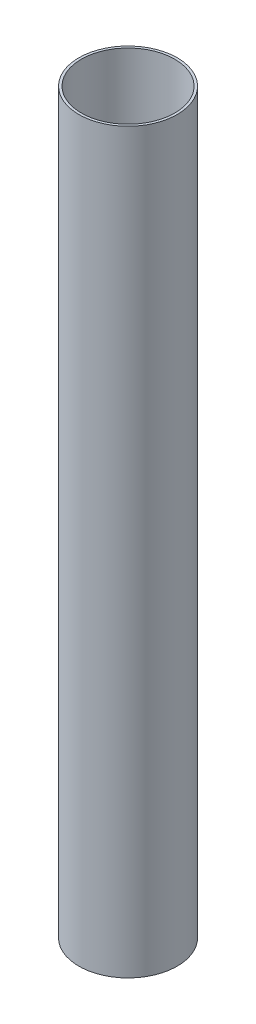
ISO-10303-21;
HEADER;
FILE_DESCRIPTION(('STEP AP214'),'2;1');
FILE_NAME('part.step','',(''),(''),'','','');
FILE_SCHEMA(('AUTOMOTIVE_DESIGN { 1 0 10303 214 1 1 1 1 }'));
ENDSEC;
DATA;
#1=APPLICATION_CONTEXT('core data for automotive mechanical design processes');
#2=APPLICATION_PROTOCOL_DEFINITION('international standard','automotive_design',2000,#1);
#3=PRODUCT_CONTEXT('',#1,'mechanical');
#4=PRODUCT('Part','Part','',(#3));
#5=PRODUCT_RELATED_PRODUCT_CATEGORY('part','',(#4));
#6=PRODUCT_DEFINITION_FORMATION('','',#4);
#7=PRODUCT_DEFINITION_CONTEXT('part definition',#1,'design');
#8=PRODUCT_DEFINITION('design','',#6,#7);
#9=PRODUCT_DEFINITION_SHAPE('','',#8);
#10=(LENGTH_UNIT() NAMED_UNIT(*) SI_UNIT(.MILLI.,.METRE.));
#11=(NAMED_UNIT(*) PLANE_ANGLE_UNIT() SI_UNIT($,.RADIAN.));
#12=(NAMED_UNIT(*) SI_UNIT($,.STERADIAN.) SOLID_ANGLE_UNIT());
#13=UNCERTAINTY_MEASURE_WITH_UNIT(LENGTH_MEASURE(1.E-05),#10,'distance_accuracy_value','');
#14=(GEOMETRIC_REPRESENTATION_CONTEXT(3) GLOBAL_UNCERTAINTY_ASSIGNED_CONTEXT((#13)) GLOBAL_UNIT_ASSIGNED_CONTEXT((#10,
#11,#12)) REPRESENTATION_CONTEXT('',''));
#15=CARTESIAN_POINT('',(0.,0.,0.));
#16=DIRECTION('',(0.,0.,1.));
#17=DIRECTION('',(1.,0.,0.));
#18=AXIS2_PLACEMENT_3D('',#15,#16,#17);
#19=CARTESIAN_POINT('',(0.,152.4,0.));
#20=DIRECTION('',(0.,1.,0.));
#21=DIRECTION('',(0.,0.,1.));
#22=AXIS2_PLACEMENT_3D('',#19,#20,#21);
#23=PLANE('',#22);
#24=CARTESIAN_POINT('',(0.,152.4,0.));
#25=DIRECTION('',(0.,1.,0.));
#26=DIRECTION('',(0.,0.,1.));
#27=AXIS2_PLACEMENT_3D('',#24,#25,#26);
#28=CIRCLE('',#27,20.32);
#29=CARTESIAN_POINT('',(0.,152.4,-20.32));
#30=VERTEX_POINT('',#29);
#31=EDGE_CURVE('E10',#30,#30,#28,.T.);
#32=ORIENTED_EDGE('',*,*,#31,.T.);
#33=EDGE_LOOP('',(#32));
#34=FACE_BOUND('',#33,.T.);
#35=CARTESIAN_POINT('',(0.,152.4,0.));
#36=DIRECTION('',(0.,1.,0.));
#37=DIRECTION('',(0.,0.,1.));
#38=AXIS2_PLACEMENT_3D('',#35,#36,#37);
#39=CIRCLE('',#38,19.304);
#40=CARTESIAN_POINT('',(0.,152.4,-19.304));
#41=VERTEX_POINT('',#40);
#42=EDGE_CURVE('E46',#41,#41,#39,.T.);
#43=ORIENTED_EDGE('',*,*,#42,.F.);
#44=EDGE_LOOP('',(#43));
#45=FACE_BOUND('',#44,.T.);
#46=ADVANCED_FACE('F35',(#34,#45),#23,.T.);
#47=CARTESIAN_POINT('',(0.,-152.4,0.));
#48=DIRECTION('',(0.,1.,0.));
#49=DIRECTION('',(0.,0.,1.));
#50=AXIS2_PLACEMENT_3D('',#47,#48,#49);
#51=PLANE('',#50);
#52=CARTESIAN_POINT('',(0.,-152.4,0.));
#53=DIRECTION('',(0.,1.,0.));
#54=DIRECTION('',(0.,0.,1.));
#55=AXIS2_PLACEMENT_3D('',#52,#53,#54);
#56=CIRCLE('',#55,20.32);
#57=CARTESIAN_POINT('',(0.,-152.4,-20.32));
#58=VERTEX_POINT('',#57);
#59=EDGE_CURVE('E39',#58,#58,#56,.T.);
#60=ORIENTED_EDGE('',*,*,#59,.F.);
#61=EDGE_LOOP('',(#60));
#62=FACE_BOUND('',#61,.T.);
#63=CARTESIAN_POINT('',(0.,-152.4,0.));
#64=DIRECTION('',(0.,1.,0.));
#65=DIRECTION('',(0.,0.,1.));
#66=AXIS2_PLACEMENT_3D('',#63,#64,#65);
#67=CIRCLE('',#66,19.304);
#68=CARTESIAN_POINT('',(0.,-152.4,-19.304));
#69=VERTEX_POINT('',#68);
#70=EDGE_CURVE('E48',#69,#69,#67,.T.);
#71=ORIENTED_EDGE('',*,*,#70,.T.);
#72=EDGE_LOOP('',(#71));
#73=FACE_BOUND('',#72,.T.);
#74=ADVANCED_FACE('F58',(#62,#73),#51,.F.);
#75=CARTESIAN_POINT('',(0.,152.4,0.));
#76=DIRECTION('',(0.,-1.,0.));
#77=DIRECTION('',(0.,0.,-1.));
#78=AXIS2_PLACEMENT_3D('',#75,#76,#77);
#79=CYLINDRICAL_SURFACE('',#78,20.32);
#80=CARTESIAN_POINT('',(0.,152.4,-20.32));
#81=CARTESIAN_POINT('',(0.,149.225,-20.32));
#82=CARTESIAN_POINT('',(0.,146.05,-20.32));
#83=CARTESIAN_POINT('',(0.,139.7,-20.32));
#84=CARTESIAN_POINT('',(0.,136.525,-20.32));
#85=CARTESIAN_POINT('',(0.,130.175,-20.32));
#86=CARTESIAN_POINT('',(0.,127.,-20.32));
#87=CARTESIAN_POINT('',(0.,120.65,-20.32));
#88=CARTESIAN_POINT('',(0.,117.475,-20.32));
#89=CARTESIAN_POINT('',(0.,111.125,-20.32));
#90=CARTESIAN_POINT('',(0.,107.95,-20.32));
#91=CARTESIAN_POINT('',(0.,101.6,-20.32));
#92=CARTESIAN_POINT('',(0.,98.425,-20.32));
#93=CARTESIAN_POINT('',(0.,92.075,-20.32));
#94=CARTESIAN_POINT('',(0.,88.9,-20.32));
#95=CARTESIAN_POINT('',(0.,82.55,-20.32));
#96=CARTESIAN_POINT('',(0.,79.375,-20.32));
#97=CARTESIAN_POINT('',(0.,73.025,-20.32));
#98=CARTESIAN_POINT('',(0.,69.85,-20.32));
#99=CARTESIAN_POINT('',(0.,63.5,-20.32));
#100=CARTESIAN_POINT('',(0.,60.325,-20.32));
#101=CARTESIAN_POINT('',(0.,53.975,-20.32));
#102=CARTESIAN_POINT('',(0.,50.8,-20.32));
#103=CARTESIAN_POINT('',(0.,44.45,-20.32));
#104=CARTESIAN_POINT('',(0.,41.275,-20.32));
#105=CARTESIAN_POINT('',(0.,34.925,-20.32));
#106=CARTESIAN_POINT('',(0.,31.75,-20.32));
#107=CARTESIAN_POINT('',(0.,25.4,-20.32));
#108=CARTESIAN_POINT('',(0.,22.225,-20.32));
#109=CARTESIAN_POINT('',(0.,15.875,-20.32));
#110=CARTESIAN_POINT('',(0.,12.7,-20.32));
#111=CARTESIAN_POINT('',(0.,6.35,-20.32));
#112=CARTESIAN_POINT('',(0.,3.175,-20.32));
#113=CARTESIAN_POINT('',(0.,-3.175,-20.32));
#114=CARTESIAN_POINT('',(0.,-6.35,-20.32));
#115=CARTESIAN_POINT('',(0.,-12.7,-20.32));
#116=CARTESIAN_POINT('',(0.,-15.875,-20.32));
#117=CARTESIAN_POINT('',(0.,-22.225,-20.32));
#118=CARTESIAN_POINT('',(0.,-25.4,-20.32));
#119=CARTESIAN_POINT('',(0.,-31.75,-20.32));
#120=CARTESIAN_POINT('',(0.,-34.925,-20.32));
#121=CARTESIAN_POINT('',(0.,-41.275,-20.32));
#122=CARTESIAN_POINT('',(0.,-44.45,-20.32));
#123=CARTESIAN_POINT('',(0.,-50.8,-20.32));
#124=CARTESIAN_POINT('',(0.,-53.975,-20.32));
#125=CARTESIAN_POINT('',(0.,-60.325,-20.32));
#126=CARTESIAN_POINT('',(0.,-63.5,-20.32));
#127=CARTESIAN_POINT('',(0.,-69.85,-20.32));
#128=CARTESIAN_POINT('',(0.,-73.025,-20.32));
#129=CARTESIAN_POINT('',(0.,-79.375,-20.32));
#130=CARTESIAN_POINT('',(0.,-82.55,-20.32));
#131=CARTESIAN_POINT('',(0.,-88.9,-20.32));
#132=CARTESIAN_POINT('',(0.,-92.075,-20.32));
#133=CARTESIAN_POINT('',(0.,-98.425,-20.32));
#134=CARTESIAN_POINT('',(0.,-101.6,-20.32));
#135=CARTESIAN_POINT('',(0.,-107.95,-20.32));
#136=CARTESIAN_POINT('',(0.,-111.125,-20.32));
#137=CARTESIAN_POINT('',(0.,-117.475,-20.32));
#138=CARTESIAN_POINT('',(0.,-120.65,-20.32));
#139=CARTESIAN_POINT('',(0.,-127.,-20.32));
#140=CARTESIAN_POINT('',(0.,-130.175,-20.32));
#141=CARTESIAN_POINT('',(0.,-136.525,-20.32));
#142=CARTESIAN_POINT('',(0.,-139.7,-20.32));
#143=CARTESIAN_POINT('',(0.,-146.05,-20.32));
#144=CARTESIAN_POINT('',(0.,-149.225,-20.32));
#145=CARTESIAN_POINT('',(0.,-152.4,-20.32));
#146=B_SPLINE_CURVE_WITH_KNOTS('',3,(#80,#81,#82,#83,#84,#85,#86,#87,#88,#89,#90,#91,#92,#93,
#94,#95,#96,#97,#98,#99,#100,#101,#102,#103,#104,#105,#106,#107,#108,#109,#110,#111,#112,#113,
#114,#115,#116,#117,#118,#119,#120,#121,#122,#123,#124,#125,#126,#127,#128,#129,#130,#131,#132,
#133,#134,#135,#136,#137,#138,#139,#140,#141,#142,#143,#144,#145),.UNSPECIFIED.,.F.,.F.,(4,2,2,
2,2,2,2,2,2,2,2,2,2,2,2,2,2,2,2,2,2,2,2,2,2,2,2,2,2,2,2,2,4),(0.,9.52500000000001,19.05,28.575,
38.1,47.625,57.15,66.675,76.2,85.725,95.25,104.775,114.3,123.825,133.35,142.875,152.4,161.925,
171.45,180.975,190.5,200.025,209.55,219.075,228.6,238.125,247.65,257.175,266.7,276.225,285.75,
295.275,304.8),.UNSPECIFIED.);
#147=EDGE_CURVE('BSEAM37',#30,#58,#146,.T.);
#148=ORIENTED_EDGE('',*,*,#31,.F.);
#149=ORIENTED_EDGE('',*,*,#59,.T.);
#150=ORIENTED_EDGE('',*,*,#147,.T.);
#151=ORIENTED_EDGE('',*,*,#147,.F.);
#152=EDGE_LOOP('',(#148,#150,#149,#151));
#153=FACE_BOUND('',#152,.T.);
#154=ADVANCED_FACE('F37',(#153),#79,.T.);
#155=CARTESIAN_POINT('',(0.,152.4,0.));
#156=DIRECTION('',(0.,-1.,0.));
#157=DIRECTION('',(0.,0.,-1.));
#158=AXIS2_PLACEMENT_3D('',#155,#156,#157);
#159=CYLINDRICAL_SURFACE('',#158,19.304);
#160=CARTESIAN_POINT('',(0.,152.4,-19.304));
#161=CARTESIAN_POINT('',(0.,149.225,-19.304));
#162=CARTESIAN_POINT('',(0.,146.05,-19.304));
#163=CARTESIAN_POINT('',(0.,139.7,-19.304));
#164=CARTESIAN_POINT('',(0.,136.525,-19.304));
#165=CARTESIAN_POINT('',(0.,130.175,-19.304));
#166=CARTESIAN_POINT('',(0.,127.,-19.304));
#167=CARTESIAN_POINT('',(0.,120.65,-19.304));
#168=CARTESIAN_POINT('',(0.,117.475,-19.304));
#169=CARTESIAN_POINT('',(0.,111.125,-19.304));
#170=CARTESIAN_POINT('',(0.,107.95,-19.304));
#171=CARTESIAN_POINT('',(0.,101.6,-19.304));
#172=CARTESIAN_POINT('',(0.,98.425,-19.304));
#173=CARTESIAN_POINT('',(0.,92.075,-19.304));
#174=CARTESIAN_POINT('',(0.,88.9,-19.304));
#175=CARTESIAN_POINT('',(0.,82.55,-19.304));
#176=CARTESIAN_POINT('',(0.,79.375,-19.304));
#177=CARTESIAN_POINT('',(0.,73.025,-19.304));
#178=CARTESIAN_POINT('',(0.,69.85,-19.304));
#179=CARTESIAN_POINT('',(0.,63.5,-19.304));
#180=CARTESIAN_POINT('',(0.,60.325,-19.304));
#181=CARTESIAN_POINT('',(0.,53.975,-19.304));
#182=CARTESIAN_POINT('',(0.,50.8,-19.304));
#183=CARTESIAN_POINT('',(0.,44.45,-19.304));
#184=CARTESIAN_POINT('',(0.,41.275,-19.304));
#185=CARTESIAN_POINT('',(0.,34.925,-19.304));
#186=CARTESIAN_POINT('',(0.,31.75,-19.304));
#187=CARTESIAN_POINT('',(0.,25.4,-19.304));
#188=CARTESIAN_POINT('',(0.,22.225,-19.304));
#189=CARTESIAN_POINT('',(0.,15.875,-19.304));
#190=CARTESIAN_POINT('',(0.,12.7,-19.304));
#191=CARTESIAN_POINT('',(0.,6.35,-19.304));
#192=CARTESIAN_POINT('',(0.,3.175,-19.304));
#193=CARTESIAN_POINT('',(0.,-3.175,-19.304));
#194=CARTESIAN_POINT('',(0.,-6.35,-19.304));
#195=CARTESIAN_POINT('',(0.,-12.7,-19.304));
#196=CARTESIAN_POINT('',(0.,-15.875,-19.304));
#197=CARTESIAN_POINT('',(0.,-22.225,-19.304));
#198=CARTESIAN_POINT('',(0.,-25.4,-19.304));
#199=CARTESIAN_POINT('',(0.,-31.75,-19.304));
#200=CARTESIAN_POINT('',(0.,-34.925,-19.304));
#201=CARTESIAN_POINT('',(0.,-41.275,-19.304));
#202=CARTESIAN_POINT('',(0.,-44.45,-19.304));
#203=CARTESIAN_POINT('',(0.,-50.8,-19.304));
#204=CARTESIAN_POINT('',(0.,-53.975,-19.304));
#205=CARTESIAN_POINT('',(0.,-60.325,-19.304));
#206=CARTESIAN_POINT('',(0.,-63.5,-19.304));
#207=CARTESIAN_POINT('',(0.,-69.85,-19.304));
#208=CARTESIAN_POINT('',(0.,-73.025,-19.304));
#209=CARTESIAN_POINT('',(0.,-79.375,-19.304));
#210=CARTESIAN_POINT('',(0.,-82.55,-19.304));
#211=CARTESIAN_POINT('',(0.,-88.9,-19.304));
#212=CARTESIAN_POINT('',(0.,-92.075,-19.304));
#213=CARTESIAN_POINT('',(0.,-98.425,-19.304));
#214=CARTESIAN_POINT('',(0.,-101.6,-19.304));
#215=CARTESIAN_POINT('',(0.,-107.95,-19.304));
#216=CARTESIAN_POINT('',(0.,-111.125,-19.304));
#217=CARTESIAN_POINT('',(0.,-117.475,-19.304));
#218=CARTESIAN_POINT('',(0.,-120.65,-19.304));
#219=CARTESIAN_POINT('',(0.,-127.,-19.304));
#220=CARTESIAN_POINT('',(0.,-130.175,-19.304));
#221=CARTESIAN_POINT('',(0.,-136.525,-19.304));
#222=CARTESIAN_POINT('',(0.,-139.7,-19.304));
#223=CARTESIAN_POINT('',(0.,-146.05,-19.304));
#224=CARTESIAN_POINT('',(0.,-149.225,-19.304));
#225=CARTESIAN_POINT('',(0.,-152.4,-19.304));
#226=B_SPLINE_CURVE_WITH_KNOTS('',3,(#160,#161,#162,#163,#164,#165,#166,#167,#168,#169,#170,
#171,#172,#173,#174,#175,#176,#177,#178,#179,#180,#181,#182,#183,#184,#185,#186,#187,#188,#189,
#190,#191,#192,#193,#194,#195,#196,#197,#198,#199,#200,#201,#202,#203,#204,#205,#206,#207,#208,
#209,#210,#211,#212,#213,#214,#215,#216,#217,#218,#219,#220,#221,#222,#223,#224,#225),
.UNSPECIFIED.,.F.,.F.,(4,2,2,2,2,2,2,2,2,2,2,2,2,2,2,2,2,2,2,2,2,2,2,2,2,2,2,2,2,2,2,2,4),(0.,
9.52500000000001,19.05,28.575,38.1,47.625,57.15,66.675,76.2,85.725,95.25,104.775,114.3,123.825,
133.35,142.875,152.4,161.925,171.45,180.975,190.5,200.025,209.55,219.075,228.6,238.125,247.65,
257.175,266.7,276.225,285.75,295.275,304.8),.UNSPECIFIED.);
#227=EDGE_CURVE('BSEAM54',#41,#69,#226,.T.);
#228=ORIENTED_EDGE('',*,*,#42,.T.);
#229=ORIENTED_EDGE('',*,*,#70,.F.);
#230=ORIENTED_EDGE('',*,*,#227,.T.);
#231=ORIENTED_EDGE('',*,*,#227,.F.);
#232=EDGE_LOOP('',(#228,#230,#229,#231));
#233=FACE_BOUND('',#232,.T.);
#234=ADVANCED_FACE('F54',(#233),#159,.F.);
#235=CLOSED_SHELL('',(#46,#74,#154,#234));
#236=MANIFOLD_SOLID_BREP('B2',#235);
#237=ADVANCED_BREP_SHAPE_REPRESENTATION('',(#18,#236),#14);
#238=SHAPE_DEFINITION_REPRESENTATION(#9,#237);
ENDSEC;
END-ISO-10303-21;
